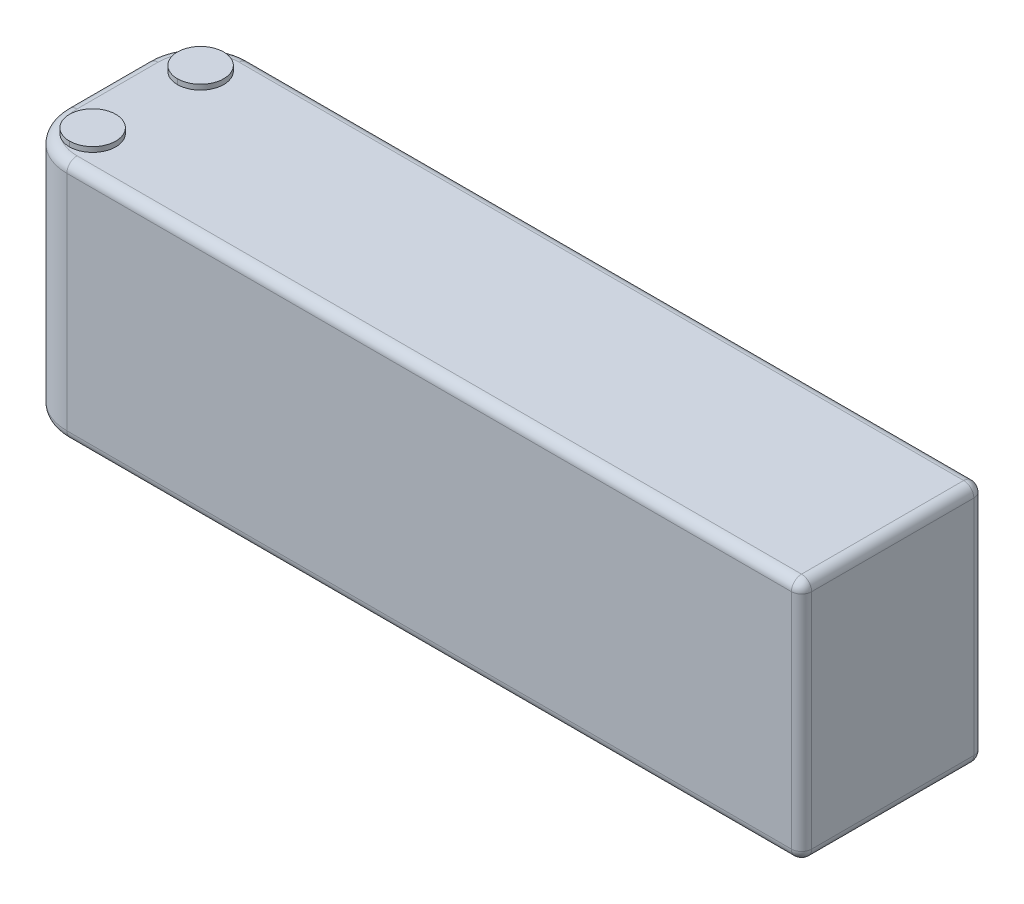
ISO-10303-21;
HEADER;
FILE_DESCRIPTION(('STEP AP214'),'2;1');
FILE_NAME('part.step','',(''),(''),'','','');
FILE_SCHEMA(('AUTOMOTIVE_DESIGN { 1 0 10303 214 1 1 1 1 }'));
ENDSEC;
DATA;
#1=APPLICATION_CONTEXT('core data for automotive mechanical design processes');
#2=APPLICATION_PROTOCOL_DEFINITION('international standard','automotive_design',2000,#1);
#3=PRODUCT_CONTEXT('',#1,'mechanical');
#4=PRODUCT('Part','Part','',(#3));
#5=PRODUCT_RELATED_PRODUCT_CATEGORY('part','',(#4));
#6=PRODUCT_DEFINITION_FORMATION('','',#4);
#7=PRODUCT_DEFINITION_CONTEXT('part definition',#1,'design');
#8=PRODUCT_DEFINITION('design','',#6,#7);
#9=PRODUCT_DEFINITION_SHAPE('','',#8);
#10=(LENGTH_UNIT() NAMED_UNIT(*) SI_UNIT(.MILLI.,.METRE.));
#11=(NAMED_UNIT(*) PLANE_ANGLE_UNIT() SI_UNIT($,.RADIAN.));
#12=(NAMED_UNIT(*) SI_UNIT($,.STERADIAN.) SOLID_ANGLE_UNIT());
#13=UNCERTAINTY_MEASURE_WITH_UNIT(LENGTH_MEASURE(1.E-05),#10,'distance_accuracy_value','');
#14=(GEOMETRIC_REPRESENTATION_CONTEXT(3) GLOBAL_UNCERTAINTY_ASSIGNED_CONTEXT((#13)) GLOBAL_UNIT_ASSIGNED_CONTEXT((#10,
#11,#12)) REPRESENTATION_CONTEXT('',''));
#15=CARTESIAN_POINT('',(0.,0.,0.));
#16=DIRECTION('',(0.,0.,1.));
#17=DIRECTION('',(1.,0.,0.));
#18=AXIS2_PLACEMENT_3D('',#15,#16,#17);
#19=CARTESIAN_POINT('',(7.73813967809833,48.,-7.34911066348702));
#20=DIRECTION('',(0.,-1.,0.));
#21=DIRECTION('',(0.,0.,-1.));
#22=AXIS2_PLACEMENT_3D('',#19,#20,#21);
#23=PLANE('',#22);
#24=CARTESIAN_POINT('',(10.,48.,-10.));
#25=DIRECTION('',(0.,1.,0.));
#26=DIRECTION('',(0.,0.,1.));
#27=AXIS2_PLACEMENT_3D('',#24,#25,#26);
#28=CIRCLE('',#27,8.);
#29=CARTESIAN_POINT('',(4.02544666851681,48.,-4.67978266522286));
#30=VERTEX_POINT('',#29);
#31=CARTESIAN_POINT('',(5.68641463750667,48.,-3.26256864075906));
#32=VERTEX_POINT('',#31);
#33=EDGE_CURVE('E340',#30,#32,#28,.T.);
#34=ORIENTED_EDGE('',*,*,#33,.T.);
#35=CARTESIAN_POINT('',(7.73813967809833,48.,-7.34911066348702));
#36=DIRECTION('',(0.,1.,0.));
#37=DIRECTION('',(0.,0.,-1.));
#38=AXIS2_PLACEMENT_3D('',#35,#36,#37);
#39=CIRCLE('',#38,4.57267988664332);
#40=EDGE_CURVE('E11',#30,#32,#39,.T.);
#41=ORIENTED_EDGE('',*,*,#40,.F.);
#42=EDGE_LOOP('',(#34,#41));
#43=FACE_BOUND('',#42,.T.);
#44=ADVANCED_FACE('F16',(#43),#23,.T.);
#45=CARTESIAN_POINT('',(7.73813967809833,49.,-7.34911066348702));
#46=DIRECTION('',(0.,-1.,0.));
#47=DIRECTION('',(0.,0.,-1.));
#48=AXIS2_PLACEMENT_3D('',#45,#46,#47);
#49=PLANE('',#48);
#50=CARTESIAN_POINT('',(7.73813967809833,49.,-7.34911066348702));
#51=DIRECTION('',(0.,1.,0.));
#52=DIRECTION('',(0.,0.,-1.));
#53=AXIS2_PLACEMENT_3D('',#50,#51,#52);
#54=CIRCLE('',#53,4.57267988664332);
#55=CARTESIAN_POINT('',(7.73813967809833,49.,-11.9217905501303));
#56=VERTEX_POINT('',#55);
#57=CARTESIAN_POINT('',(7.73813967809833,49.,-2.77643077684369));
#58=VERTEX_POINT('',#57);
#59=EDGE_CURVE('E27',#56,#58,#54,.T.);
#60=ORIENTED_EDGE('',*,*,#59,.T.);
#61=CARTESIAN_POINT('',(7.73813967809833,49.,-7.34911066348702));
#62=DIRECTION('',(0.,1.,0.));
#63=DIRECTION('',(0.,0.,-1.));
#64=AXIS2_PLACEMENT_3D('',#61,#62,#63);
#65=CIRCLE('',#64,4.57267988664332);
#66=EDGE_CURVE('E456',#58,#56,#65,.T.);
#67=ORIENTED_EDGE('',*,*,#66,.T.);
#68=EDGE_LOOP('',(#60,#67));
#69=FACE_BOUND('',#68,.T.);
#70=ADVANCED_FACE('F854',(#69),#49,.F.);
#71=CARTESIAN_POINT('',(7.73813967809833,49.,-7.34911066348702));
#72=DIRECTION('',(0.,-1.,0.));
#73=DIRECTION('',(0.,0.,-1.));
#74=AXIS2_PLACEMENT_3D('',#71,#72,#73);
#75=CYLINDRICAL_SURFACE('',#74,4.57267988664332);
#76=DIRECTION('',(0.,-1.,0.));
#77=VECTOR('',#76,1.);
#78=CARTESIAN_POINT('',(7.73813967809833,49.,-2.77643077684369));
#79=LINE('',#78,#77);
#80=CARTESIAN_POINT('',(7.73813967809833,48.,-2.77643077684369));
#81=VERTEX_POINT('',#80);
#82=EDGE_CURVE('E433',#58,#81,#79,.T.);
#83=ORIENTED_EDGE('',*,*,#82,.F.);
#84=ORIENTED_EDGE('',*,*,#59,.F.);
#85=DIRECTION('',(0.,-1.,0.));
#86=VECTOR('',#85,1.);
#87=CARTESIAN_POINT('',(7.73813967809833,49.,-11.9217905501303));
#88=LINE('',#87,#86);
#89=CARTESIAN_POINT('',(7.73813967809833,48.,-11.9217905501303));
#90=VERTEX_POINT('',#89);
#91=EDGE_CURVE('E313',#56,#90,#88,.T.);
#92=ORIENTED_EDGE('',*,*,#91,.T.);
#93=CARTESIAN_POINT('',(7.73813967809833,48.,-7.34911066348702));
#94=DIRECTION('',(0.,1.,0.));
#95=DIRECTION('',(0.,0.,-1.));
#96=AXIS2_PLACEMENT_3D('',#93,#94,#95);
#97=CIRCLE('',#96,4.57267988664332);
#98=EDGE_CURVE('E304',#90,#30,#97,.T.);
#99=ORIENTED_EDGE('',*,*,#98,.T.);
#100=ORIENTED_EDGE('',*,*,#40,.T.);
#101=CARTESIAN_POINT('',(7.73813967809833,48.,-7.34911066348702));
#102=DIRECTION('',(0.,1.,0.));
#103=DIRECTION('',(0.,0.,-1.));
#104=AXIS2_PLACEMENT_3D('',#101,#102,#103);
#105=CIRCLE('',#104,4.57267988664332);
#106=EDGE_CURVE('E265',#32,#81,#105,.T.);
#107=ORIENTED_EDGE('',*,*,#106,.T.);
#108=EDGE_LOOP('',(#83,#84,#92,#99,#100,#107));
#109=FACE_BOUND('',#108,.T.);
#110=ADVANCED_FACE('F969',(#109),#75,.T.);
#111=CARTESIAN_POINT('',(7.73813967809833,48.,-28.6508893365129));
#112=DIRECTION('',(0.,1.,0.));
#113=DIRECTION('',(1.,0.,0.));
#114=AXIS2_PLACEMENT_3D('',#111,#112,#113);
#115=PLANE('',#114);
#116=CARTESIAN_POINT('',(10.,48.,-26.));
#117=DIRECTION('',(0.,1.,0.));
#118=DIRECTION('',(0.,0.,1.));
#119=AXIS2_PLACEMENT_3D('',#116,#117,#118);
#120=CIRCLE('',#119,8.);
#121=CARTESIAN_POINT('',(5.68641463750662,48.,-32.7374313592409));
#122=VERTEX_POINT('',#121);
#123=CARTESIAN_POINT('',(4.02544666851684,48.,-31.3202173347772));
#124=VERTEX_POINT('',#123);
#125=EDGE_CURVE('E295',#122,#124,#120,.T.);
#126=ORIENTED_EDGE('',*,*,#125,.T.);
#127=CARTESIAN_POINT('',(7.73813967809833,48.,-28.6508893365129));
#128=DIRECTION('',(0.,1.,0.));
#129=DIRECTION('',(0.,0.,1.));
#130=AXIS2_PLACEMENT_3D('',#127,#128,#129);
#131=CIRCLE('',#130,4.57267988664332);
#132=EDGE_CURVE('E356',#122,#124,#131,.T.);
#133=ORIENTED_EDGE('',*,*,#132,.F.);
#134=EDGE_LOOP('',(#126,#133));
#135=FACE_BOUND('',#134,.T.);
#136=ADVANCED_FACE('F499',(#135),#115,.F.);
#137=CARTESIAN_POINT('',(7.73813967809833,49.,-28.6508893365129));
#138=DIRECTION('',(0.,1.,0.));
#139=DIRECTION('',(1.,0.,0.));
#140=AXIS2_PLACEMENT_3D('',#137,#138,#139);
#141=PLANE('',#140);
#142=CARTESIAN_POINT('',(7.73813967809833,49.,-28.6508893365129));
#143=DIRECTION('',(0.,1.,0.));
#144=DIRECTION('',(0.,0.,1.));
#145=AXIS2_PLACEMENT_3D('',#142,#143,#144);
#146=CIRCLE('',#145,4.57267988664332);
#147=CARTESIAN_POINT('',(7.73813967809833,49.,-33.2235692231563));
#148=VERTEX_POINT('',#147);
#149=CARTESIAN_POINT('',(7.73813967809833,49.,-24.0782094498697));
#150=VERTEX_POINT('',#149);
#151=EDGE_CURVE('E299',#148,#150,#146,.T.);
#152=ORIENTED_EDGE('',*,*,#151,.T.);
#153=CARTESIAN_POINT('',(7.73813967809833,49.,-28.6508893365129));
#154=DIRECTION('',(0.,1.,0.));
#155=DIRECTION('',(0.,0.,1.));
#156=AXIS2_PLACEMENT_3D('',#153,#154,#155);
#157=CIRCLE('',#156,4.57267988664332);
#158=EDGE_CURVE('E317',#150,#148,#157,.T.);
#159=ORIENTED_EDGE('',*,*,#158,.T.);
#160=EDGE_LOOP('',(#152,#159));
#161=FACE_BOUND('',#160,.T.);
#162=ADVANCED_FACE('F510',(#161),#141,.T.);
#163=CARTESIAN_POINT('',(7.73813967809833,49.,-28.6508893365129));
#164=DIRECTION('',(0.,-1.,0.));
#165=DIRECTION('',(0.,0.,-1.));
#166=AXIS2_PLACEMENT_3D('',#163,#164,#165);
#167=CYLINDRICAL_SURFACE('',#166,4.57267988664333);
#168=DIRECTION('',(0.,-1.,0.));
#169=VECTOR('',#168,1.);
#170=CARTESIAN_POINT('',(7.73813967809833,49.,-24.0782094498697));
#171=LINE('',#170,#169);
#172=CARTESIAN_POINT('',(7.73813967809833,48.,-24.0782094498697));
#173=VERTEX_POINT('',#172);
#174=EDGE_CURVE('E271',#150,#173,#171,.T.);
#175=ORIENTED_EDGE('',*,*,#174,.F.);
#176=ORIENTED_EDGE('',*,*,#151,.F.);
#177=DIRECTION('',(0.,-1.,0.));
#178=VECTOR('',#177,1.);
#179=CARTESIAN_POINT('',(7.73813967809833,49.,-33.2235692231563));
#180=LINE('',#179,#178);
#181=CARTESIAN_POINT('',(7.73813967809833,48.,-33.2235692231563));
#182=VERTEX_POINT('',#181);
#183=EDGE_CURVE('E270',#148,#182,#180,.T.);
#184=ORIENTED_EDGE('',*,*,#183,.T.);
#185=CARTESIAN_POINT('',(7.73813967809833,48.,-28.6508893365129));
#186=DIRECTION('',(0.,1.,0.));
#187=DIRECTION('',(0.,0.,1.));
#188=AXIS2_PLACEMENT_3D('',#185,#186,#187);
#189=CIRCLE('',#188,4.57267988664332);
#190=EDGE_CURVE('E293',#182,#122,#189,.T.);
#191=ORIENTED_EDGE('',*,*,#190,.T.);
#192=ORIENTED_EDGE('',*,*,#132,.T.);
#193=CARTESIAN_POINT('',(7.73813967809833,48.,-28.6508893365129));
#194=DIRECTION('',(0.,1.,0.));
#195=DIRECTION('',(0.,0.,1.));
#196=AXIS2_PLACEMENT_3D('',#193,#194,#195);
#197=CIRCLE('',#196,4.57267988664332);
#198=EDGE_CURVE('E360',#124,#173,#197,.T.);
#199=ORIENTED_EDGE('',*,*,#198,.T.);
#200=EDGE_LOOP('',(#175,#176,#184,#191,#192,#199));
#201=FACE_BOUND('',#200,.T.);
#202=ADVANCED_FACE('F493',(#201),#167,.T.);
#203=CARTESIAN_POINT('',(10.,46.,-26.));
#204=DIRECTION('',(0.,1.,0.));
#205=DIRECTION('',(0.,0.,1.));
#206=AXIS2_PLACEMENT_3D('',#203,#204,#205);
#207=TOROIDAL_SURFACE('',#206,8.,2.);
#208=CARTESIAN_POINT('',(10.,46.,-34.));
#209=DIRECTION('',(-1.,0.,0.));
#210=DIRECTION('',(0.,0.,1.));
#211=AXIS2_PLACEMENT_3D('',#208,#209,#210);
#212=CIRCLE('',#211,2.);
#213=CARTESIAN_POINT('',(10.,48.,-34.));
#214=VERTEX_POINT('',#213);
#215=CARTESIAN_POINT('',(10.,46.,-36.));
#216=VERTEX_POINT('',#215);
#217=EDGE_CURVE('E339',#214,#216,#212,.T.);
#218=ORIENTED_EDGE('',*,*,#217,.T.);
#219=CARTESIAN_POINT('',(10.,46.,-26.));
#220=DIRECTION('',(0.,-1.,0.));
#221=DIRECTION('',(0.,0.,1.));
#222=AXIS2_PLACEMENT_3D('',#219,#220,#221);
#223=CIRCLE('',#222,10.);
#224=CARTESIAN_POINT('',(0.,46.,-26.));
#225=VERTEX_POINT('',#224);
#226=EDGE_CURVE('E275',#225,#216,#223,.T.);
#227=ORIENTED_EDGE('',*,*,#226,.F.);
#228=CARTESIAN_POINT('',(2.,46.,-26.));
#229=DIRECTION('',(0.,0.,-1.));
#230=DIRECTION('',(0.,1.,0.));
#231=AXIS2_PLACEMENT_3D('',#228,#229,#230);
#232=CIRCLE('',#231,2.);
#233=CARTESIAN_POINT('',(2.,48.,-26.));
#234=VERTEX_POINT('',#233);
#235=EDGE_CURVE('E201',#225,#234,#232,.T.);
#236=ORIENTED_EDGE('',*,*,#235,.T.);
#237=CARTESIAN_POINT('',(10.,48.,-26.));
#238=DIRECTION('',(0.,1.,0.));
#239=DIRECTION('',(0.,0.,1.));
#240=AXIS2_PLACEMENT_3D('',#237,#238,#239);
#241=CIRCLE('',#240,8.);
#242=EDGE_CURVE('E363',#124,#234,#241,.T.);
#243=ORIENTED_EDGE('',*,*,#242,.F.);
#244=ORIENTED_EDGE('',*,*,#125,.F.);
#245=CARTESIAN_POINT('',(10.,48.,-26.));
#246=DIRECTION('',(0.,1.,0.));
#247=DIRECTION('',(0.,0.,1.));
#248=AXIS2_PLACEMENT_3D('',#245,#246,#247);
#249=CIRCLE('',#248,8.);
#250=EDGE_CURVE('E289',#214,#122,#249,.T.);
#251=ORIENTED_EDGE('',*,*,#250,.F.);
#252=EDGE_LOOP('',(#218,#227,#236,#243,#244,#251));
#253=FACE_BOUND('',#252,.T.);
#254=ADVANCED_FACE('F501',(#253),#207,.T.);
#255=CARTESIAN_POINT('',(2.,46.,-26.));
#256=DIRECTION('',(0.,0.,-1.));
#257=DIRECTION('',(-1.,0.,0.));
#258=AXIS2_PLACEMENT_3D('',#255,#256,#257);
#259=CYLINDRICAL_SURFACE('',#258,2.);
#260=CARTESIAN_POINT('',(2.,46.,-10.));
#261=DIRECTION('',(0.,0.,-1.));
#262=DIRECTION('',(-1.,0.,0.));
#263=AXIS2_PLACEMENT_3D('',#260,#261,#262);
#264=CIRCLE('',#263,2.);
#265=CARTESIAN_POINT('',(0.,46.,-10.));
#266=VERTEX_POINT('',#265);
#267=CARTESIAN_POINT('',(2.,48.,-10.));
#268=VERTEX_POINT('',#267);
#269=EDGE_CURVE('E88',#266,#268,#264,.T.);
#270=ORIENTED_EDGE('',*,*,#269,.T.);
#271=DIRECTION('',(0.,0.,1.));
#272=VECTOR('',#271,1.);
#273=CARTESIAN_POINT('',(2.,48.,-10.));
#274=LINE('',#273,#272);
#275=EDGE_CURVE('E400',#234,#268,#274,.T.);
#276=ORIENTED_EDGE('',*,*,#275,.F.);
#277=ORIENTED_EDGE('',*,*,#235,.F.);
#278=DIRECTION('',(0.,0.,-1.));
#279=VECTOR('',#278,1.);
#280=CARTESIAN_POINT('',(0.,46.,-26.));
#281=LINE('',#280,#279);
#282=EDGE_CURVE('E333',#266,#225,#281,.T.);
#283=ORIENTED_EDGE('',*,*,#282,.F.);
#284=EDGE_LOOP('',(#270,#276,#277,#283));
#285=FACE_BOUND('',#284,.T.);
#286=ADVANCED_FACE('F902',(#285),#259,.T.);
#287=CARTESIAN_POINT('',(10.,46.,-34.));
#288=DIRECTION('',(1.,0.,0.));
#289=DIRECTION('',(0.,0.,-1.));
#290=AXIS2_PLACEMENT_3D('',#287,#288,#289);
#291=CYLINDRICAL_SURFACE('',#290,2.);
#292=CARTESIAN_POINT('',(153.,46.,-34.));
#293=DIRECTION('',(-1.,0.,0.));
#294=DIRECTION('',(0.,0.,-1.));
#295=AXIS2_PLACEMENT_3D('',#292,#293,#294);
#296=CIRCLE('',#295,2.);
#297=CARTESIAN_POINT('',(153.,48.,-34.));
#298=VERTEX_POINT('',#297);
#299=CARTESIAN_POINT('',(153.,46.,-36.));
#300=VERTEX_POINT('',#299);
#301=EDGE_CURVE('E347',#298,#300,#296,.T.);
#302=ORIENTED_EDGE('',*,*,#301,.T.);
#303=DIRECTION('',(1.,0.,0.));
#304=VECTOR('',#303,1.);
#305=CARTESIAN_POINT('',(155.,46.,-36.));
#306=LINE('',#305,#304);
#307=EDGE_CURVE('E282',#216,#300,#306,.T.);
#308=ORIENTED_EDGE('',*,*,#307,.F.);
#309=ORIENTED_EDGE('',*,*,#217,.F.);
#310=DIRECTION('',(-1.,0.,0.));
#311=VECTOR('',#310,1.);
#312=CARTESIAN_POINT('',(10.,48.,-34.));
#313=LINE('',#312,#311);
#314=EDGE_CURVE('E294',#298,#214,#313,.T.);
#315=ORIENTED_EDGE('',*,*,#314,.F.);
#316=EDGE_LOOP('',(#302,#308,#309,#315));
#317=FACE_BOUND('',#316,.T.);
#318=ADVANCED_FACE('F906',(#317),#291,.T.);
#319=CARTESIAN_POINT('',(10.,46.,-10.));
#320=DIRECTION('',(0.,1.,0.));
#321=DIRECTION('',(0.,0.,1.));
#322=AXIS2_PLACEMENT_3D('',#319,#320,#321);
#323=TOROIDAL_SURFACE('',#322,8.,2.);
#324=CARTESIAN_POINT('',(10.,46.,-2.));
#325=DIRECTION('',(-1.,0.,0.));
#326=DIRECTION('',(0.,-1.,0.));
#327=AXIS2_PLACEMENT_3D('',#324,#325,#326);
#328=CIRCLE('',#327,2.);
#329=CARTESIAN_POINT('',(10.,46.,0.));
#330=VERTEX_POINT('',#329);
#331=CARTESIAN_POINT('',(10.,48.,-2.));
#332=VERTEX_POINT('',#331);
#333=EDGE_CURVE('E421',#330,#332,#328,.T.);
#334=ORIENTED_EDGE('',*,*,#333,.T.);
#335=CARTESIAN_POINT('',(10.,48.,-10.));
#336=DIRECTION('',(0.,1.,0.));
#337=DIRECTION('',(0.,0.,1.));
#338=AXIS2_PLACEMENT_3D('',#335,#336,#337);
#339=CIRCLE('',#338,8.);
#340=EDGE_CURVE('E288',#32,#332,#339,.T.);
#341=ORIENTED_EDGE('',*,*,#340,.F.);
#342=ORIENTED_EDGE('',*,*,#33,.F.);
#343=CARTESIAN_POINT('',(10.,48.,-10.));
#344=DIRECTION('',(0.,1.,0.));
#345=DIRECTION('',(0.,0.,1.));
#346=AXIS2_PLACEMENT_3D('',#343,#344,#345);
#347=CIRCLE('',#346,8.);
#348=EDGE_CURVE('E300',#268,#30,#347,.T.);
#349=ORIENTED_EDGE('',*,*,#348,.F.);
#350=ORIENTED_EDGE('',*,*,#269,.F.);
#351=CARTESIAN_POINT('',(10.,46.,-10.));
#352=DIRECTION('',(0.,-1.,0.));
#353=DIRECTION('',(0.,0.,1.));
#354=AXIS2_PLACEMENT_3D('',#351,#352,#353);
#355=CIRCLE('',#354,10.);
#356=EDGE_CURVE('E261',#330,#266,#355,.T.);
#357=ORIENTED_EDGE('',*,*,#356,.F.);
#358=EDGE_LOOP('',(#334,#341,#342,#349,#350,#357));
#359=FACE_BOUND('',#358,.T.);
#360=ADVANCED_FACE('F999',(#359),#323,.T.);
#361=CARTESIAN_POINT('',(153.,46.,-34.));
#362=DIRECTION('',(0.,1.,0.));
#363=DIRECTION('',(0.,0.,-1.));
#364=AXIS2_PLACEMENT_3D('',#361,#362,#363);
#365=SPHERICAL_SURFACE('',#364,2.);
#366=CARTESIAN_POINT('',(153.,46.,-34.));
#367=DIRECTION('',(0.,0.,-1.));
#368=DIRECTION('',(-1.,0.,0.));
#369=AXIS2_PLACEMENT_3D('',#366,#367,#368);
#370=CIRCLE('',#369,2.);
#371=CARTESIAN_POINT('',(155.,46.,-34.));
#372=VERTEX_POINT('',#371);
#373=EDGE_CURVE('E352',#298,#372,#370,.T.);
#374=ORIENTED_EDGE('',*,*,#373,.T.);
#375=CARTESIAN_POINT('',(153.,46.,-34.));
#376=DIRECTION('',(0.,1.,0.));
#377=DIRECTION('',(0.,0.,1.));
#378=AXIS2_PLACEMENT_3D('',#375,#376,#377);
#379=CIRCLE('',#378,2.);
#380=EDGE_CURVE('E348',#372,#300,#379,.T.);
#381=ORIENTED_EDGE('',*,*,#380,.T.);
#382=ORIENTED_EDGE('',*,*,#301,.F.);
#383=EDGE_LOOP('',(#374,#381,#382));
#384=FACE_BOUND('',#383,.T.);
#385=ADVANCED_FACE('F733',(#384),#365,.T.);
#386=CARTESIAN_POINT('',(10.,46.,-2.));
#387=DIRECTION('',(-1.,0.,0.));
#388=DIRECTION('',(0.,0.,1.));
#389=AXIS2_PLACEMENT_3D('',#386,#387,#388);
#390=CYLINDRICAL_SURFACE('',#389,2.);
#391=CARTESIAN_POINT('',(153.,46.,-2.));
#392=DIRECTION('',(-1.,0.,0.));
#393=DIRECTION('',(0.,0.,-1.));
#394=AXIS2_PLACEMENT_3D('',#391,#392,#393);
#395=CIRCLE('',#394,2.);
#396=CARTESIAN_POINT('',(153.,46.,0.));
#397=VERTEX_POINT('',#396);
#398=CARTESIAN_POINT('',(153.,48.,-2.));
#399=VERTEX_POINT('',#398);
#400=EDGE_CURVE('E324',#397,#399,#395,.T.);
#401=ORIENTED_EDGE('',*,*,#400,.T.);
#402=DIRECTION('',(1.,0.,0.));
#403=VECTOR('',#402,1.);
#404=CARTESIAN_POINT('',(155.,48.,-2.));
#405=LINE('',#404,#403);
#406=EDGE_CURVE('E283',#332,#399,#405,.T.);
#407=ORIENTED_EDGE('',*,*,#406,.F.);
#408=ORIENTED_EDGE('',*,*,#333,.F.);
#409=DIRECTION('',(-1.,0.,0.));
#410=VECTOR('',#409,1.);
#411=CARTESIAN_POINT('',(10.,46.,0.));
#412=LINE('',#411,#410);
#413=EDGE_CURVE('E247',#397,#330,#412,.T.);
#414=ORIENTED_EDGE('',*,*,#413,.F.);
#415=EDGE_LOOP('',(#401,#407,#408,#414));
#416=FACE_BOUND('',#415,.T.);
#417=ADVANCED_FACE('F727',(#416),#390,.T.);
#418=CARTESIAN_POINT('',(153.,46.,-26.));
#419=DIRECTION('',(0.,0.,1.));
#420=DIRECTION('',(1.,0.,0.));
#421=AXIS2_PLACEMENT_3D('',#418,#419,#420);
#422=CYLINDRICAL_SURFACE('',#421,2.);
#423=CARTESIAN_POINT('',(153.,46.,-2.));
#424=DIRECTION('',(0.,0.,-1.));
#425=DIRECTION('',(0.,-1.,0.));
#426=AXIS2_PLACEMENT_3D('',#423,#424,#425);
#427=CIRCLE('',#426,2.);
#428=CARTESIAN_POINT('',(155.,46.,-2.));
#429=VERTEX_POINT('',#428);
#430=EDGE_CURVE('E353',#399,#429,#427,.T.);
#431=ORIENTED_EDGE('',*,*,#430,.T.);
#432=DIRECTION('',(0.,0.,1.));
#433=VECTOR('',#432,1.);
#434=CARTESIAN_POINT('',(155.,46.,0.));
#435=LINE('',#434,#433);
#436=EDGE_CURVE('E367',#372,#429,#435,.T.);
#437=ORIENTED_EDGE('',*,*,#436,.F.);
#438=ORIENTED_EDGE('',*,*,#373,.F.);
#439=DIRECTION('',(0.,0.,-1.));
#440=VECTOR('',#439,1.);
#441=CARTESIAN_POINT('',(153.,48.,-36.));
#442=LINE('',#441,#440);
#443=EDGE_CURVE('E287',#399,#298,#442,.T.);
#444=ORIENTED_EDGE('',*,*,#443,.F.);
#445=EDGE_LOOP('',(#431,#437,#438,#444));
#446=FACE_BOUND('',#445,.T.);
#447=ADVANCED_FACE('F732',(#446),#422,.T.);
#448=CARTESIAN_POINT('',(153.,48.,-34.));
#449=DIRECTION('',(0.,-1.,0.));
#450=DIRECTION('',(0.,0.,-1.));
#451=AXIS2_PLACEMENT_3D('',#448,#449,#450);
#452=CYLINDRICAL_SURFACE('',#451,2.);
#453=CARTESIAN_POINT('',(153.,2.,-34.));
#454=DIRECTION('',(0.,1.,0.));
#455=DIRECTION('',(0.,0.,-1.));
#456=AXIS2_PLACEMENT_3D('',#453,#454,#455);
#457=CIRCLE('',#456,2.);
#458=CARTESIAN_POINT('',(155.,2.,-34.));
#459=VERTEX_POINT('',#458);
#460=CARTESIAN_POINT('',(153.,2.,-36.));
#461=VERTEX_POINT('',#460);
#462=EDGE_CURVE('E321',#459,#461,#457,.T.);
#463=ORIENTED_EDGE('',*,*,#462,.T.);
#464=DIRECTION('',(0.,-1.,0.));
#465=VECTOR('',#464,1.);
#466=CARTESIAN_POINT('',(153.,48.,-36.));
#467=LINE('',#466,#465);
#468=EDGE_CURVE('E278',#300,#461,#467,.T.);
#469=ORIENTED_EDGE('',*,*,#468,.F.);
#470=ORIENTED_EDGE('',*,*,#380,.F.);
#471=DIRECTION('',(0.,1.,0.));
#472=VECTOR('',#471,1.);
#473=CARTESIAN_POINT('',(155.,48.,-34.));
#474=LINE('',#473,#472);
#475=EDGE_CURVE('E375',#459,#372,#474,.T.);
#476=ORIENTED_EDGE('',*,*,#475,.F.);
#477=EDGE_LOOP('',(#463,#469,#470,#476));
#478=FACE_BOUND('',#477,.T.);
#479=ADVANCED_FACE('F809',(#478),#452,.T.);
#480=CARTESIAN_POINT('',(153.,46.,-2.));
#481=DIRECTION('',(0.,1.,0.));
#482=DIRECTION('',(0.,0.,-1.));
#483=AXIS2_PLACEMENT_3D('',#480,#481,#482);
#484=SPHERICAL_SURFACE('',#483,2.);
#485=ORIENTED_EDGE('',*,*,#400,.F.);
#486=CARTESIAN_POINT('',(153.,46.,-2.));
#487=DIRECTION('',(0.,1.,0.));
#488=DIRECTION('',(0.,0.,1.));
#489=AXIS2_PLACEMENT_3D('',#486,#487,#488);
#490=CIRCLE('',#489,2.);
#491=EDGE_CURVE('E242',#397,#429,#490,.T.);
#492=ORIENTED_EDGE('',*,*,#491,.T.);
#493=ORIENTED_EDGE('',*,*,#430,.F.);
#494=EDGE_LOOP('',(#485,#492,#493));
#495=FACE_BOUND('',#494,.T.);
#496=ADVANCED_FACE('F804',(#495),#484,.T.);
#497=CARTESIAN_POINT('',(153.,2.,-34.));
#498=DIRECTION('',(1.,0.,0.));
#499=DIRECTION('',(0.,0.,-1.));
#500=AXIS2_PLACEMENT_3D('',#497,#498,#499);
#501=SPHERICAL_SURFACE('',#500,2.);
#502=CARTESIAN_POINT('',(153.,2.,-34.));
#503=DIRECTION('',(0.,0.,-1.));
#504=DIRECTION('',(-1.,0.,0.));
#505=AXIS2_PLACEMENT_3D('',#502,#503,#504);
#506=CIRCLE('',#505,2.);
#507=CARTESIAN_POINT('',(153.,0.,-34.));
#508=VERTEX_POINT('',#507);
#509=EDGE_CURVE('E42',#459,#508,#506,.T.);
#510=ORIENTED_EDGE('',*,*,#509,.T.);
#511=CARTESIAN_POINT('',(153.,2.,-34.));
#512=DIRECTION('',(1.,0.,0.));
#513=DIRECTION('',(0.,0.,-1.));
#514=AXIS2_PLACEMENT_3D('',#511,#512,#513);
#515=CIRCLE('',#514,2.);
#516=EDGE_CURVE('E305',#508,#461,#515,.T.);
#517=ORIENTED_EDGE('',*,*,#516,.T.);
#518=ORIENTED_EDGE('',*,*,#462,.F.);
#519=EDGE_LOOP('',(#510,#517,#518));
#520=FACE_BOUND('',#519,.T.);
#521=ADVANCED_FACE('F808',(#520),#501,.T.);
#522=CARTESIAN_POINT('',(153.,48.,-2.));
#523=DIRECTION('',(0.,-1.,0.));
#524=DIRECTION('',(0.,0.,-1.));
#525=AXIS2_PLACEMENT_3D('',#522,#523,#524);
#526=CYLINDRICAL_SURFACE('',#525,2.);
#527=CARTESIAN_POINT('',(153.,2.,-2.));
#528=DIRECTION('',(0.,1.,0.));
#529=DIRECTION('',(0.,0.,-1.));
#530=AXIS2_PLACEMENT_3D('',#527,#528,#529);
#531=CIRCLE('',#530,2.);
#532=CARTESIAN_POINT('',(153.,2.,0.));
#533=VERTEX_POINT('',#532);
#534=CARTESIAN_POINT('',(155.,2.,-2.));
#535=VERTEX_POINT('',#534);
#536=EDGE_CURVE('E214',#533,#535,#531,.T.);
#537=ORIENTED_EDGE('',*,*,#536,.T.);
#538=DIRECTION('',(0.,-1.,0.));
#539=VECTOR('',#538,1.);
#540=CARTESIAN_POINT('',(155.,48.,-2.));
#541=LINE('',#540,#539);
#542=EDGE_CURVE('E364',#429,#535,#541,.T.);
#543=ORIENTED_EDGE('',*,*,#542,.F.);
#544=ORIENTED_EDGE('',*,*,#491,.F.);
#545=DIRECTION('',(0.,1.,0.));
#546=VECTOR('',#545,1.);
#547=CARTESIAN_POINT('',(153.,48.,0.));
#548=LINE('',#547,#546);
#549=EDGE_CURVE('E239',#533,#397,#548,.T.);
#550=ORIENTED_EDGE('',*,*,#549,.F.);
#551=EDGE_LOOP('',(#537,#543,#544,#550));
#552=FACE_BOUND('',#551,.T.);
#553=ADVANCED_FACE('F240',(#552),#526,.T.);
#554=CARTESIAN_POINT('',(153.,2.,0.));
#555=DIRECTION('',(0.,0.,-1.));
#556=DIRECTION('',(-1.,0.,0.));
#557=AXIS2_PLACEMENT_3D('',#554,#555,#556);
#558=CYLINDRICAL_SURFACE('',#557,2.);
#559=CARTESIAN_POINT('',(153.,2.,-2.));
#560=DIRECTION('',(0.,0.,-1.));
#561=DIRECTION('',(1.,0.,0.));
#562=AXIS2_PLACEMENT_3D('',#559,#560,#561);
#563=CIRCLE('',#562,2.);
#564=CARTESIAN_POINT('',(153.,0.,-2.));
#565=VERTEX_POINT('',#564);
#566=EDGE_CURVE('E188',#535,#565,#563,.T.);
#567=ORIENTED_EDGE('',*,*,#566,.T.);
#568=DIRECTION('',(0.,0.,1.));
#569=VECTOR('',#568,1.);
#570=CARTESIAN_POINT('',(153.,0.,-26.));
#571=LINE('',#570,#569);
#572=EDGE_CURVE('E376',#508,#565,#571,.T.);
#573=ORIENTED_EDGE('',*,*,#572,.F.);
#574=ORIENTED_EDGE('',*,*,#509,.F.);
#575=DIRECTION('',(0.,0.,-1.));
#576=VECTOR('',#575,1.);
#577=CARTESIAN_POINT('',(155.,2.,0.));
#578=LINE('',#577,#576);
#579=EDGE_CURVE('E371',#535,#459,#578,.T.);
#580=ORIENTED_EDGE('',*,*,#579,.F.);
#581=EDGE_LOOP('',(#567,#573,#574,#580));
#582=FACE_BOUND('',#581,.T.);
#583=ADVANCED_FACE('F743',(#582),#558,.T.);
#584=CARTESIAN_POINT('',(155.,2.,-34.));
#585=DIRECTION('',(-1.,0.,0.));
#586=DIRECTION('',(0.,0.,1.));
#587=AXIS2_PLACEMENT_3D('',#584,#585,#586);
#588=CYLINDRICAL_SURFACE('',#587,2.);
#589=CARTESIAN_POINT('',(10.,2.,-34.));
#590=DIRECTION('',(1.,0.,0.));
#591=DIRECTION('',(0.,0.,-1.));
#592=AXIS2_PLACEMENT_3D('',#589,#590,#591);
#593=CIRCLE('',#592,2.);
#594=CARTESIAN_POINT('',(10.,0.,-34.));
#595=VERTEX_POINT('',#594);
#596=CARTESIAN_POINT('',(10.,2.,-36.));
#597=VERTEX_POINT('',#596);
#598=EDGE_CURVE('E224',#595,#597,#593,.T.);
#599=ORIENTED_EDGE('',*,*,#598,.T.);
#600=DIRECTION('',(-1.,0.,0.));
#601=VECTOR('',#600,1.);
#602=CARTESIAN_POINT('',(155.,2.,-36.));
#603=LINE('',#602,#601);
#604=EDGE_CURVE('E276',#461,#597,#603,.T.);
#605=ORIENTED_EDGE('',*,*,#604,.F.);
#606=ORIENTED_EDGE('',*,*,#516,.F.);
#607=DIRECTION('',(1.,0.,0.));
#608=VECTOR('',#607,1.);
#609=CARTESIAN_POINT('',(10.,0.,-34.));
#610=LINE('',#609,#608);
#611=EDGE_CURVE('E380',#595,#508,#610,.T.);
#612=ORIENTED_EDGE('',*,*,#611,.F.);
#613=EDGE_LOOP('',(#599,#605,#606,#612));
#614=FACE_BOUND('',#613,.T.);
#615=ADVANCED_FACE('F747',(#614),#588,.T.);
#616=CARTESIAN_POINT('',(153.,2.,-2.));
#617=DIRECTION('',(1.,0.,0.));
#618=DIRECTION('',(0.,0.,-1.));
#619=AXIS2_PLACEMENT_3D('',#616,#617,#618);
#620=SPHERICAL_SURFACE('',#619,2.);
#621=ORIENTED_EDGE('',*,*,#536,.F.);
#622=CARTESIAN_POINT('',(153.,2.,-2.));
#623=DIRECTION('',(1.,0.,0.));
#624=DIRECTION('',(0.,0.,-1.));
#625=AXIS2_PLACEMENT_3D('',#622,#623,#624);
#626=CIRCLE('',#625,2.);
#627=EDGE_CURVE('E217',#533,#565,#626,.T.);
#628=ORIENTED_EDGE('',*,*,#627,.T.);
#629=ORIENTED_EDGE('',*,*,#566,.F.);
#630=EDGE_LOOP('',(#621,#628,#629));
#631=FACE_BOUND('',#630,.T.);
#632=ADVANCED_FACE('F216',(#631),#620,.T.);
#633=CARTESIAN_POINT('',(10.,2.,-26.));
#634=DIRECTION('',(0.,1.,0.));
#635=DIRECTION('',(0.,0.,1.));
#636=AXIS2_PLACEMENT_3D('',#633,#634,#635);
#637=TOROIDAL_SURFACE('',#636,8.,2.);
#638=CARTESIAN_POINT('',(2.,2.,-26.));
#639=DIRECTION('',(0.,0.,-1.));
#640=DIRECTION('',(-1.,0.,0.));
#641=AXIS2_PLACEMENT_3D('',#638,#639,#640);
#642=CIRCLE('',#641,2.);
#643=CARTESIAN_POINT('',(2.,0.,-26.));
#644=VERTEX_POINT('',#643);
#645=CARTESIAN_POINT('',(0.,2.,-26.));
#646=VERTEX_POINT('',#645);
#647=EDGE_CURVE('E104',#644,#646,#642,.T.);
#648=ORIENTED_EDGE('',*,*,#647,.T.);
#649=CARTESIAN_POINT('',(10.,2.,-26.));
#650=DIRECTION('',(0.,1.,0.));
#651=DIRECTION('',(0.,0.,1.));
#652=AXIS2_PLACEMENT_3D('',#649,#650,#651);
#653=CIRCLE('',#652,10.);
#654=EDGE_CURVE('E328',#597,#646,#653,.T.);
#655=ORIENTED_EDGE('',*,*,#654,.F.);
#656=ORIENTED_EDGE('',*,*,#598,.F.);
#657=CARTESIAN_POINT('',(10.,0.,-26.));
#658=DIRECTION('',(0.,-1.,0.));
#659=DIRECTION('',(0.,0.,1.));
#660=AXIS2_PLACEMENT_3D('',#657,#658,#659);
#661=CIRCLE('',#660,8.);
#662=EDGE_CURVE('E404',#644,#595,#661,.T.);
#663=ORIENTED_EDGE('',*,*,#662,.F.);
#664=EDGE_LOOP('',(#648,#655,#656,#663));
#665=FACE_BOUND('',#664,.T.);
#666=ADVANCED_FACE('F765',(#665),#637,.T.);
#667=CARTESIAN_POINT('',(10.,2.,-2.));
#668=DIRECTION('',(1.,0.,0.));
#669=DIRECTION('',(0.,0.,-1.));
#670=AXIS2_PLACEMENT_3D('',#667,#668,#669);
#671=CYLINDRICAL_SURFACE('',#670,2.);
#672=CARTESIAN_POINT('',(10.,2.,-2.));
#673=DIRECTION('',(1.,0.,0.));
#674=DIRECTION('',(0.,0.,-1.));
#675=AXIS2_PLACEMENT_3D('',#672,#673,#674);
#676=CIRCLE('',#675,2.);
#677=CARTESIAN_POINT('',(10.,2.,0.));
#678=VERTEX_POINT('',#677);
#679=CARTESIAN_POINT('',(10.,0.,-2.));
#680=VERTEX_POINT('',#679);
#681=EDGE_CURVE('E379',#678,#680,#676,.T.);
#682=ORIENTED_EDGE('',*,*,#681,.T.);
#683=DIRECTION('',(-1.,0.,0.));
#684=VECTOR('',#683,1.);
#685=CARTESIAN_POINT('',(10.,0.,-2.));
#686=LINE('',#685,#684);
#687=EDGE_CURVE('E234',#565,#680,#686,.T.);
#688=ORIENTED_EDGE('',*,*,#687,.F.);
#689=ORIENTED_EDGE('',*,*,#627,.F.);
#690=DIRECTION('',(1.,0.,0.));
#691=VECTOR('',#690,1.);
#692=CARTESIAN_POINT('',(10.,2.,0.));
#693=LINE('',#692,#691);
#694=EDGE_CURVE('E231',#678,#533,#693,.T.);
#695=ORIENTED_EDGE('',*,*,#694,.F.);
#696=EDGE_LOOP('',(#682,#688,#689,#695));
#697=FACE_BOUND('',#696,.T.);
#698=ADVANCED_FACE('F229',(#697),#671,.T.);
#699=CARTESIAN_POINT('',(2.,2.,-26.));
#700=DIRECTION('',(0.,0.,1.));
#701=DIRECTION('',(1.,0.,0.));
#702=AXIS2_PLACEMENT_3D('',#699,#700,#701);
#703=CYLINDRICAL_SURFACE('',#702,2.);
#704=CARTESIAN_POINT('',(2.,2.,-10.));
#705=DIRECTION('',(0.,0.,-1.));
#706=DIRECTION('',(-1.,0.,0.));
#707=AXIS2_PLACEMENT_3D('',#704,#705,#706);
#708=CIRCLE('',#707,2.);
#709=CARTESIAN_POINT('',(2.,0.,-10.));
#710=VERTEX_POINT('',#709);
#711=CARTESIAN_POINT('',(0.,2.,-10.));
#712=VERTEX_POINT('',#711);
#713=EDGE_CURVE('E370',#710,#712,#708,.T.);
#714=ORIENTED_EDGE('',*,*,#713,.T.);
#715=DIRECTION('',(0.,0.,1.));
#716=VECTOR('',#715,1.);
#717=CARTESIAN_POINT('',(0.,2.,-26.));
#718=LINE('',#717,#716);
#719=EDGE_CURVE('E396',#646,#712,#718,.T.);
#720=ORIENTED_EDGE('',*,*,#719,.F.);
#721=ORIENTED_EDGE('',*,*,#647,.F.);
#722=DIRECTION('',(0.,0.,-1.));
#723=VECTOR('',#722,1.);
#724=CARTESIAN_POINT('',(2.,0.,-26.));
#725=LINE('',#724,#723);
#726=EDGE_CURVE('E312',#710,#644,#725,.T.);
#727=ORIENTED_EDGE('',*,*,#726,.F.);
#728=EDGE_LOOP('',(#714,#720,#721,#727));
#729=FACE_BOUND('',#728,.T.);
#730=ADVANCED_FACE('F795',(#729),#703,.T.);
#731=CARTESIAN_POINT('',(10.,2.,-10.));
#732=DIRECTION('',(0.,1.,0.));
#733=DIRECTION('',(0.,0.,1.));
#734=AXIS2_PLACEMENT_3D('',#731,#732,#733);
#735=TOROIDAL_SURFACE('',#734,8.,2.);
#736=ORIENTED_EDGE('',*,*,#681,.F.);
#737=CARTESIAN_POINT('',(10.,2.,-10.));
#738=DIRECTION('',(0.,1.,0.));
#739=DIRECTION('',(0.,0.,1.));
#740=AXIS2_PLACEMENT_3D('',#737,#738,#739);
#741=CIRCLE('',#740,10.);
#742=EDGE_CURVE('E254',#712,#678,#741,.T.);
#743=ORIENTED_EDGE('',*,*,#742,.F.);
#744=ORIENTED_EDGE('',*,*,#713,.F.);
#745=CARTESIAN_POINT('',(10.,0.,-10.));
#746=DIRECTION('',(0.,-1.,0.));
#747=DIRECTION('',(0.,0.,1.));
#748=AXIS2_PLACEMENT_3D('',#745,#746,#747);
#749=CIRCLE('',#748,8.);
#750=EDGE_CURVE('E308',#680,#710,#749,.T.);
#751=ORIENTED_EDGE('',*,*,#750,.F.);
#752=EDGE_LOOP('',(#736,#743,#744,#751));
#753=FACE_BOUND('',#752,.T.);
#754=ADVANCED_FACE('F790',(#753),#735,.T.);
#755=CARTESIAN_POINT('',(10.,0.,-26.));
#756=DIRECTION('',(0.,1.,0.));
#757=DIRECTION('',(1.,0.,0.));
#758=AXIS2_PLACEMENT_3D('',#755,#756,#757);
#759=PLANE('',#758);
#760=ORIENTED_EDGE('',*,*,#687,.T.);
#761=ORIENTED_EDGE('',*,*,#750,.T.);
#762=ORIENTED_EDGE('',*,*,#726,.T.);
#763=ORIENTED_EDGE('',*,*,#662,.T.);
#764=ORIENTED_EDGE('',*,*,#611,.T.);
#765=ORIENTED_EDGE('',*,*,#572,.T.);
#766=EDGE_LOOP('',(#760,#761,#762,#763,#764,#765));
#767=FACE_BOUND('',#766,.T.);
#768=ADVANCED_FACE('F794',(#767),#759,.F.);
#769=CARTESIAN_POINT('',(10.,48.,-26.));
#770=DIRECTION('',(0.,1.,0.));
#771=DIRECTION('',(1.,0.,0.));
#772=AXIS2_PLACEMENT_3D('',#769,#770,#771);
#773=PLANE('',#772);
#774=ORIENTED_EDGE('',*,*,#348,.T.);
#775=ORIENTED_EDGE('',*,*,#98,.F.);
#776=CARTESIAN_POINT('',(7.73813967809833,48.,-7.34911066348702));
#777=DIRECTION('',(0.,1.,0.));
#778=DIRECTION('',(0.,0.,-1.));
#779=AXIS2_PLACEMENT_3D('',#776,#777,#778);
#780=CIRCLE('',#779,4.57267988664332);
#781=EDGE_CURVE('E318',#81,#90,#780,.T.);
#782=ORIENTED_EDGE('',*,*,#781,.F.);
#783=ORIENTED_EDGE('',*,*,#106,.F.);
#784=ORIENTED_EDGE('',*,*,#340,.T.);
#785=ORIENTED_EDGE('',*,*,#406,.T.);
#786=ORIENTED_EDGE('',*,*,#443,.T.);
#787=ORIENTED_EDGE('',*,*,#314,.T.);
#788=ORIENTED_EDGE('',*,*,#250,.T.);
#789=ORIENTED_EDGE('',*,*,#190,.F.);
#790=CARTESIAN_POINT('',(7.73813967809833,48.,-28.6508893365129));
#791=DIRECTION('',(0.,1.,0.));
#792=DIRECTION('',(0.,0.,1.));
#793=AXIS2_PLACEMENT_3D('',#790,#791,#792);
#794=CIRCLE('',#793,4.57267988664332);
#795=EDGE_CURVE('E267',#173,#182,#794,.T.);
#796=ORIENTED_EDGE('',*,*,#795,.F.);
#797=ORIENTED_EDGE('',*,*,#198,.F.);
#798=ORIENTED_EDGE('',*,*,#242,.T.);
#799=ORIENTED_EDGE('',*,*,#275,.T.);
#800=EDGE_LOOP('',(#774,#775,#782,#783,#784,#785,#786,#787,#788,#789,#796,#797,#798,#799));
#801=FACE_BOUND('',#800,.T.);
#802=ADVANCED_FACE('F503',(#801),#773,.T.);
#803=CARTESIAN_POINT('',(10.,48.,0.));
#804=DIRECTION('',(0.,0.,-1.));
#805=DIRECTION('',(0.,-1.,0.));
#806=AXIS2_PLACEMENT_3D('',#803,#804,#805);
#807=PLANE('',#806);
#808=DIRECTION('',(0.,-1.,0.));
#809=VECTOR('',#808,1.);
#810=CARTESIAN_POINT('',(10.,48.,0.));
#811=LINE('',#810,#809);
#812=EDGE_CURVE('E252',#330,#678,#811,.T.);
#813=ORIENTED_EDGE('',*,*,#812,.T.);
#814=ORIENTED_EDGE('',*,*,#694,.T.);
#815=ORIENTED_EDGE('',*,*,#549,.T.);
#816=ORIENTED_EDGE('',*,*,#413,.T.);
#817=EDGE_LOOP('',(#813,#814,#815,#816));
#818=FACE_BOUND('',#817,.T.);
#819=ADVANCED_FACE('F250',(#818),#807,.F.);
#820=CARTESIAN_POINT('',(10.,48.,-10.));
#821=DIRECTION('',(0.,-1.,0.));
#822=DIRECTION('',(0.,0.,-1.));
#823=AXIS2_PLACEMENT_3D('',#820,#821,#822);
#824=CYLINDRICAL_SURFACE('',#823,10.);
#825=ORIENTED_EDGE('',*,*,#812,.F.);
#826=ORIENTED_EDGE('',*,*,#356,.T.);
#827=DIRECTION('',(0.,-1.,0.));
#828=VECTOR('',#827,1.);
#829=CARTESIAN_POINT('',(0.,48.,-10.));
#830=LINE('',#829,#828);
#831=EDGE_CURVE('E329',#266,#712,#830,.T.);
#832=ORIENTED_EDGE('',*,*,#831,.T.);
#833=ORIENTED_EDGE('',*,*,#742,.T.);
#834=EDGE_LOOP('',(#825,#826,#832,#833));
#835=FACE_BOUND('',#834,.T.);
#836=ADVANCED_FACE('F18',(#835),#824,.T.);
#837=CARTESIAN_POINT('',(0.,48.,-26.));
#838=DIRECTION('',(1.,0.,0.));
#839=DIRECTION('',(0.,1.,0.));
#840=AXIS2_PLACEMENT_3D('',#837,#838,#839);
#841=PLANE('',#840);
#842=ORIENTED_EDGE('',*,*,#831,.F.);
#843=ORIENTED_EDGE('',*,*,#282,.T.);
#844=DIRECTION('',(0.,-1.,0.));
#845=VECTOR('',#844,1.);
#846=CARTESIAN_POINT('',(0.,48.,-26.));
#847=LINE('',#846,#845);
#848=EDGE_CURVE('E272',#225,#646,#847,.T.);
#849=ORIENTED_EDGE('',*,*,#848,.T.);
#850=ORIENTED_EDGE('',*,*,#719,.T.);
#851=EDGE_LOOP('',(#842,#843,#849,#850));
#852=FACE_BOUND('',#851,.T.);
#853=ADVANCED_FACE('F781',(#852),#841,.F.);
#854=CARTESIAN_POINT('',(10.,48.,-26.));
#855=DIRECTION('',(0.,-1.,0.));
#856=DIRECTION('',(0.,0.,-1.));
#857=AXIS2_PLACEMENT_3D('',#854,#855,#856);
#858=CYLINDRICAL_SURFACE('',#857,10.);
#859=ORIENTED_EDGE('',*,*,#848,.F.);
#860=ORIENTED_EDGE('',*,*,#226,.T.);
#861=DIRECTION('',(0.,-1.,0.));
#862=VECTOR('',#861,1.);
#863=CARTESIAN_POINT('',(10.,48.,-36.));
#864=LINE('',#863,#862);
#865=EDGE_CURVE('E20',#216,#597,#864,.T.);
#866=ORIENTED_EDGE('',*,*,#865,.T.);
#867=ORIENTED_EDGE('',*,*,#654,.T.);
#868=EDGE_LOOP('',(#859,#860,#866,#867));
#869=FACE_BOUND('',#868,.T.);
#870=ADVANCED_FACE('F776',(#869),#858,.T.);
#871=CARTESIAN_POINT('',(155.,48.,-36.));
#872=DIRECTION('',(0.,0.,1.));
#873=DIRECTION('',(1.,0.,0.));
#874=AXIS2_PLACEMENT_3D('',#871,#872,#873);
#875=PLANE('',#874);
#876=ORIENTED_EDGE('',*,*,#865,.F.);
#877=ORIENTED_EDGE('',*,*,#307,.T.);
#878=ORIENTED_EDGE('',*,*,#468,.T.);
#879=ORIENTED_EDGE('',*,*,#604,.T.);
#880=EDGE_LOOP('',(#876,#877,#878,#879));
#881=FACE_BOUND('',#880,.T.);
#882=ADVANCED_FACE('F780',(#881),#875,.F.);
#883=CARTESIAN_POINT('',(155.,48.,0.));
#884=DIRECTION('',(-1.,0.,0.));
#885=DIRECTION('',(0.,0.,1.));
#886=AXIS2_PLACEMENT_3D('',#883,#884,#885);
#887=PLANE('',#886);
#888=ORIENTED_EDGE('',*,*,#579,.T.);
#889=ORIENTED_EDGE('',*,*,#475,.T.);
#890=ORIENTED_EDGE('',*,*,#436,.T.);
#891=ORIENTED_EDGE('',*,*,#542,.T.);
#892=EDGE_LOOP('',(#888,#889,#890,#891));
#893=FACE_BOUND('',#892,.T.);
#894=ADVANCED_FACE('F873',(#893),#887,.F.);
#895=CARTESIAN_POINT('',(7.73813967809833,49.,-28.6508893365129));
#896=DIRECTION('',(0.,-1.,0.));
#897=DIRECTION('',(0.,0.,-1.));
#898=AXIS2_PLACEMENT_3D('',#895,#896,#897);
#899=CYLINDRICAL_SURFACE('',#898,4.57267988664333);
#900=ORIENTED_EDGE('',*,*,#158,.F.);
#901=ORIENTED_EDGE('',*,*,#174,.T.);
#902=ORIENTED_EDGE('',*,*,#795,.T.);
#903=ORIENTED_EDGE('',*,*,#183,.F.);
#904=EDGE_LOOP('',(#900,#901,#902,#903));
#905=FACE_BOUND('',#904,.T.);
#906=ADVANCED_FACE('F507',(#905),#899,.T.);
#907=CARTESIAN_POINT('',(7.73813967809833,49.,-7.34911066348702));
#908=DIRECTION('',(0.,-1.,0.));
#909=DIRECTION('',(0.,0.,-1.));
#910=AXIS2_PLACEMENT_3D('',#907,#908,#909);
#911=CYLINDRICAL_SURFACE('',#910,4.57267988664332);
#912=ORIENTED_EDGE('',*,*,#66,.F.);
#913=ORIENTED_EDGE('',*,*,#82,.T.);
#914=ORIENTED_EDGE('',*,*,#781,.T.);
#915=ORIENTED_EDGE('',*,*,#91,.F.);
#916=EDGE_LOOP('',(#912,#913,#914,#915));
#917=FACE_BOUND('',#916,.T.);
#918=ADVANCED_FACE('F818',(#917),#911,.T.);
#919=CLOSED_SHELL('',(#44,#70,#110,#136,#162,#202,#254,#286,#318,#360,#385,#417,#447,#479,#496,
#521,#553,#583,#615,#632,#666,#698,#730,#754,#768,#802,#819,#836,#853,#870,#882,#894,#906,#918));
#920=MANIFOLD_SOLID_BREP('B1',#919);
#921=ADVANCED_BREP_SHAPE_REPRESENTATION('',(#18,#920),#14);
#922=SHAPE_DEFINITION_REPRESENTATION(#9,#921);
ENDSEC;
END-ISO-10303-21;
